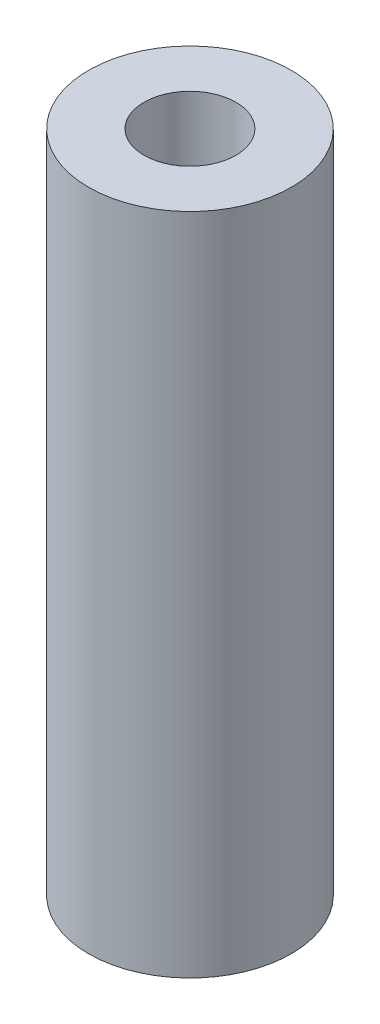
ISO-10303-21;
HEADER;
FILE_DESCRIPTION(('STEP AP214'),'2;1');
FILE_NAME('part.step','',(''),(''),'','','');
FILE_SCHEMA(('AUTOMOTIVE_DESIGN { 1 0 10303 214 1 1 1 1 }'));
ENDSEC;
DATA;
#1=APPLICATION_CONTEXT('core data for automotive mechanical design processes');
#2=APPLICATION_PROTOCOL_DEFINITION('international standard','automotive_design',2000,#1);
#3=PRODUCT_CONTEXT('',#1,'mechanical');
#4=PRODUCT('Part','Part','',(#3));
#5=PRODUCT_RELATED_PRODUCT_CATEGORY('part','',(#4));
#6=PRODUCT_DEFINITION_FORMATION('','',#4);
#7=PRODUCT_DEFINITION_CONTEXT('part definition',#1,'design');
#8=PRODUCT_DEFINITION('design','',#6,#7);
#9=PRODUCT_DEFINITION_SHAPE('','',#8);
#10=(LENGTH_UNIT() NAMED_UNIT(*) SI_UNIT(.MILLI.,.METRE.));
#11=(NAMED_UNIT(*) PLANE_ANGLE_UNIT() SI_UNIT($,.RADIAN.));
#12=(NAMED_UNIT(*) SI_UNIT($,.STERADIAN.) SOLID_ANGLE_UNIT());
#13=UNCERTAINTY_MEASURE_WITH_UNIT(LENGTH_MEASURE(1.E-05),#10,'distance_accuracy_value','');
#14=(GEOMETRIC_REPRESENTATION_CONTEXT(3) GLOBAL_UNCERTAINTY_ASSIGNED_CONTEXT((#13)) GLOBAL_UNIT_ASSIGNED_CONTEXT((#10,
#11,#12)) REPRESENTATION_CONTEXT('',''));
#15=CARTESIAN_POINT('',(0.,0.,0.));
#16=DIRECTION('',(0.,0.,1.));
#17=DIRECTION('',(1.,0.,0.));
#18=AXIS2_PLACEMENT_3D('',#15,#16,#17);
#19=CARTESIAN_POINT('',(0.,39.,0.));
#20=DIRECTION('',(0.,-1.,0.));
#21=DIRECTION('',(0.,0.,-1.));
#22=AXIS2_PLACEMENT_3D('',#19,#20,#21);
#23=CYLINDRICAL_SURFACE('',#22,5.955);
#24=CARTESIAN_POINT('',(0.,39.,0.));
#25=DIRECTION('',(0.,1.,0.));
#26=DIRECTION('',(0.,0.,1.));
#27=AXIS2_PLACEMENT_3D('',#24,#25,#26);
#28=CIRCLE('',#27,5.955);
#29=CARTESIAN_POINT('',(0.,39.,5.955));
#30=VERTEX_POINT('',#29);
#31=EDGE_CURVE('E10',#30,#30,#28,.T.);
#32=ORIENTED_EDGE('',*,*,#31,.F.);
#33=EDGE_LOOP('',(#32));
#34=FACE_BOUND('',#33,.T.);
#35=CARTESIAN_POINT('',(0.,0.,0.));
#36=DIRECTION('',(0.,1.,0.));
#37=DIRECTION('',(0.,0.,1.));
#38=AXIS2_PLACEMENT_3D('',#35,#36,#37);
#39=CIRCLE('',#38,5.955);
#40=CARTESIAN_POINT('',(0.,0.,5.955));
#41=VERTEX_POINT('',#40);
#42=EDGE_CURVE('E46',#41,#41,#39,.T.);
#43=ORIENTED_EDGE('',*,*,#42,.T.);
#44=EDGE_LOOP('',(#43));
#45=FACE_BOUND('',#44,.T.);
#46=ADVANCED_FACE('F43',(#34,#45),#23,.T.);
#47=CARTESIAN_POINT('',(0.,39.,0.));
#48=DIRECTION('',(0.,1.,0.));
#49=DIRECTION('',(0.,0.,1.));
#50=AXIS2_PLACEMENT_3D('',#47,#48,#49);
#51=PLANE('',#50);
#52=CARTESIAN_POINT('',(0.,39.,0.));
#53=DIRECTION('',(0.,1.,0.));
#54=DIRECTION('',(0.,0.,1.));
#55=AXIS2_PLACEMENT_3D('',#52,#53,#54);
#56=CIRCLE('',#55,2.7);
#57=CARTESIAN_POINT('',(0.,39.,2.7));
#58=VERTEX_POINT('',#57);
#59=EDGE_CURVE('E57',#58,#58,#56,.T.);
#60=ORIENTED_EDGE('',*,*,#59,.F.);
#61=EDGE_LOOP('',(#60));
#62=FACE_BOUND('',#61,.T.);
#63=ORIENTED_EDGE('',*,*,#31,.T.);
#64=EDGE_LOOP('',(#63));
#65=FACE_BOUND('',#64,.T.);
#66=ADVANCED_FACE('F74',(#62,#65),#51,.T.);
#67=CARTESIAN_POINT('',(0.,0.,0.));
#68=DIRECTION('',(0.,1.,0.));
#69=DIRECTION('',(0.,0.,1.));
#70=AXIS2_PLACEMENT_3D('',#67,#68,#69);
#71=PLANE('',#70);
#72=ORIENTED_EDGE('',*,*,#42,.F.);
#73=EDGE_LOOP('',(#72));
#74=FACE_BOUND('',#73,.T.);
#75=ADVANCED_FACE('F70',(#74),#71,.F.);
#76=CARTESIAN_POINT('',(0.,34.5,0.));
#77=DIRECTION('',(0.,1.,0.));
#78=DIRECTION('',(0.,0.,1.));
#79=AXIS2_PLACEMENT_3D('',#76,#77,#78);
#80=CYLINDRICAL_SURFACE('',#79,2.7);
#81=CARTESIAN_POINT('',(0.,34.5,0.));
#82=DIRECTION('',(0.,1.,0.));
#83=DIRECTION('',(0.,0.,1.));
#84=AXIS2_PLACEMENT_3D('',#81,#82,#83);
#85=CIRCLE('',#84,2.7);
#86=CARTESIAN_POINT('',(0.,34.5,2.7));
#87=VERTEX_POINT('',#86);
#88=EDGE_CURVE('E55',#87,#87,#85,.T.);
#89=ORIENTED_EDGE('',*,*,#88,.F.);
#90=EDGE_LOOP('',(#89));
#91=FACE_BOUND('',#90,.T.);
#92=ORIENTED_EDGE('',*,*,#59,.T.);
#93=EDGE_LOOP('',(#92));
#94=FACE_BOUND('',#93,.T.);
#95=ADVANCED_FACE('F67',(#91,#94),#80,.F.);
#96=CARTESIAN_POINT('',(0.,34.5,0.));
#97=DIRECTION('',(0.,1.,0.));
#98=DIRECTION('',(0.,0.,1.));
#99=AXIS2_PLACEMENT_3D('',#96,#97,#98);
#100=PLANE('',#99);
#101=ORIENTED_EDGE('',*,*,#88,.T.);
#102=EDGE_LOOP('',(#101));
#103=FACE_BOUND('',#102,.T.);
#104=ADVANCED_FACE('F65',(#103),#100,.T.);
#105=CLOSED_SHELL('',(#46,#66,#75,#95,#104));
#106=MANIFOLD_SOLID_BREP('B2',#105);
#107=ADVANCED_BREP_SHAPE_REPRESENTATION('',(#18,#106),#14);
#108=SHAPE_DEFINITION_REPRESENTATION(#9,#107);
ENDSEC;
END-ISO-10303-21;
